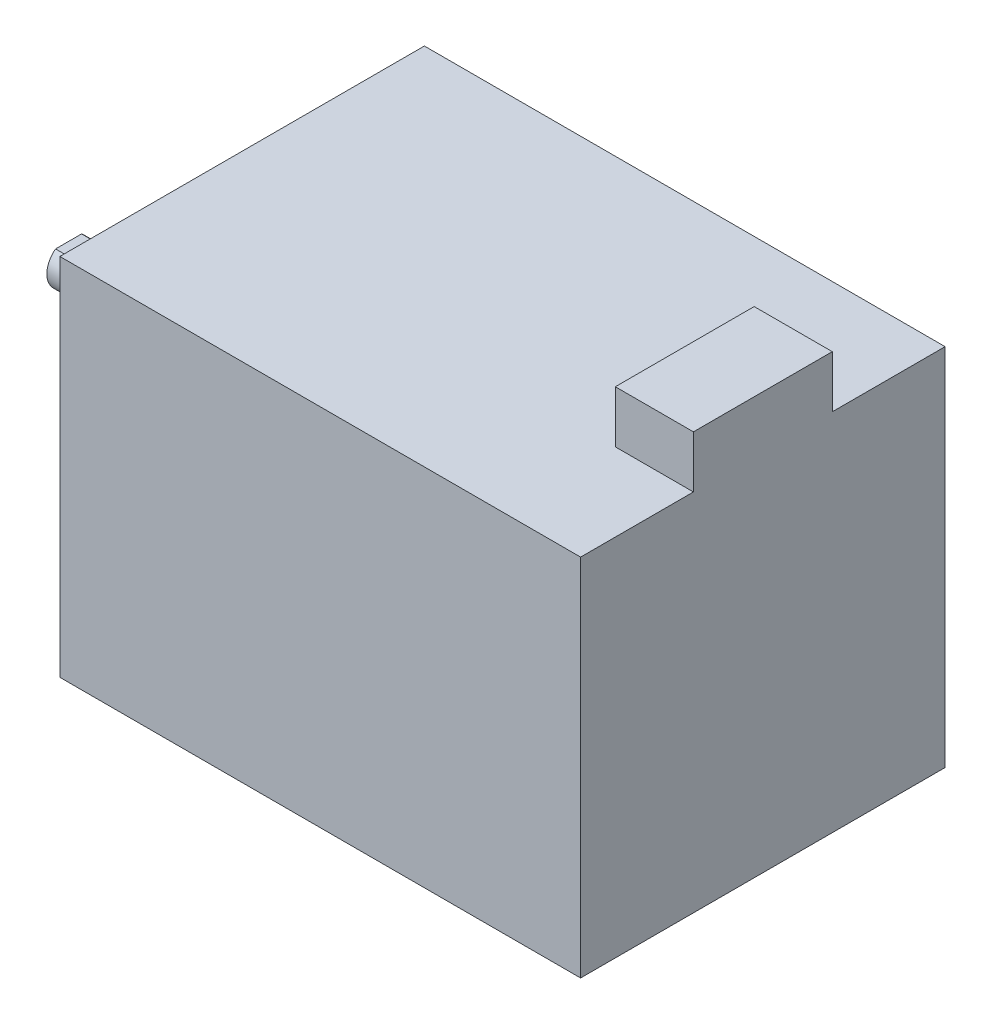
ISO-10303-21;
HEADER;
FILE_DESCRIPTION(('STEP AP214'),'2;1');
FILE_NAME('part.step','',(''),(''),'','','');
FILE_SCHEMA(('AUTOMOTIVE_DESIGN { 1 0 10303 214 1 1 1 1 }'));
ENDSEC;
DATA;
#1=APPLICATION_CONTEXT('core data for automotive mechanical design processes');
#2=APPLICATION_PROTOCOL_DEFINITION('international standard','automotive_design',2000,#1);
#3=PRODUCT_CONTEXT('',#1,'mechanical');
#4=PRODUCT('Part','Part','',(#3));
#5=PRODUCT_RELATED_PRODUCT_CATEGORY('part','',(#4));
#6=PRODUCT_DEFINITION_FORMATION('','',#4);
#7=PRODUCT_DEFINITION_CONTEXT('part definition',#1,'design');
#8=PRODUCT_DEFINITION('design','',#6,#7);
#9=PRODUCT_DEFINITION_SHAPE('','',#8);
#10=(LENGTH_UNIT() NAMED_UNIT(*) SI_UNIT(.MILLI.,.METRE.));
#11=(NAMED_UNIT(*) PLANE_ANGLE_UNIT() SI_UNIT($,.RADIAN.));
#12=(NAMED_UNIT(*) SI_UNIT($,.STERADIAN.) SOLID_ANGLE_UNIT());
#13=UNCERTAINTY_MEASURE_WITH_UNIT(LENGTH_MEASURE(1.E-05),#10,'distance_accuracy_value','');
#14=(GEOMETRIC_REPRESENTATION_CONTEXT(3) GLOBAL_UNCERTAINTY_ASSIGNED_CONTEXT((#13)) GLOBAL_UNIT_ASSIGNED_CONTEXT((#10,
#11,#12)) REPRESENTATION_CONTEXT('',''));
#15=CARTESIAN_POINT('',(0.,0.,0.));
#16=DIRECTION('',(0.,0.,1.));
#17=DIRECTION('',(1.,0.,0.));
#18=AXIS2_PLACEMENT_3D('',#15,#16,#17);
#19=CARTESIAN_POINT('',(0.,0.,0.));
#20=DIRECTION('',(1.,0.,0.));
#21=DIRECTION('',(0.,0.,-1.));
#22=AXIS2_PLACEMENT_3D('',#19,#20,#21);
#23=PLANE('',#22);
#24=CARTESIAN_POINT('',(0.,15.5,15.5));
#25=DIRECTION('',(1.,0.,0.));
#26=DIRECTION('',(0.,0.,-1.));
#27=AXIS2_PLACEMENT_3D('',#24,#25,#26);
#28=CIRCLE('',#27,1.50000000000002);
#29=CARTESIAN_POINT('',(0.,15.5,14.));
#30=VERTEX_POINT('',#29);
#31=EDGE_CURVE('E502',#30,#30,#28,.F.);
#32=ORIENTED_EDGE('',*,*,#31,.F.);
#33=EDGE_LOOP('',(#32));
#34=FACE_BOUND('',#33,.T.);
#35=CARTESIAN_POINT('',(0.,-15.5,15.5));
#36=DIRECTION('',(1.,0.,0.));
#37=DIRECTION('',(0.,0.,-1.));
#38=AXIS2_PLACEMENT_3D('',#35,#36,#37);
#39=CIRCLE('',#38,1.5);
#40=CARTESIAN_POINT('',(0.,-15.5,14.));
#41=VERTEX_POINT('',#40);
#42=EDGE_CURVE('E495',#41,#41,#39,.T.);
#43=ORIENTED_EDGE('',*,*,#42,.T.);
#44=EDGE_LOOP('',(#43));
#45=FACE_BOUND('',#44,.T.);
#46=DIRECTION('',(0.,0.,-1.));
#47=VECTOR('',#46,1.);
#48=CARTESIAN_POINT('',(0.,2.,0.));
#49=LINE('',#48,#47);
#50=CARTESIAN_POINT('',(0.,2.,1.5));
#51=VERTEX_POINT('',#50);
#52=CARTESIAN_POINT('',(0.,2.,-1.5));
#53=VERTEX_POINT('',#52);
#54=EDGE_CURVE('E63',#51,#53,#49,.T.);
#55=ORIENTED_EDGE('',*,*,#54,.F.);
#56=CARTESIAN_POINT('',(0.,0.,0.));
#57=DIRECTION('',(1.,0.,0.));
#58=DIRECTION('',(0.,0.,-1.));
#59=AXIS2_PLACEMENT_3D('',#56,#57,#58);
#60=CIRCLE('',#59,2.5);
#61=EDGE_CURVE('E144',#51,#53,#60,.T.);
#62=ORIENTED_EDGE('',*,*,#61,.T.);
#63=EDGE_LOOP('',(#55,#62));
#64=FACE_BOUND('',#63,.T.);
#65=DIRECTION('',(0.,0.,-1.));
#66=VECTOR('',#65,1.);
#67=CARTESIAN_POINT('',(0.,21.,0.));
#68=LINE('',#67,#66);
#69=CARTESIAN_POINT('',(0.,21.,21.));
#70=VERTEX_POINT('',#69);
#71=CARTESIAN_POINT('',(0.,21.,-21.));
#72=VERTEX_POINT('',#71);
#73=EDGE_CURVE('E192',#70,#72,#68,.T.);
#74=ORIENTED_EDGE('',*,*,#73,.T.);
#75=DIRECTION('',(0.,1.,0.));
#76=VECTOR('',#75,1.);
#77=CARTESIAN_POINT('',(0.,0.,-21.));
#78=LINE('',#77,#76);
#79=CARTESIAN_POINT('',(0.,-21.,-21.));
#80=VERTEX_POINT('',#79);
#81=EDGE_CURVE('E188',#80,#72,#78,.T.);
#82=ORIENTED_EDGE('',*,*,#81,.F.);
#83=DIRECTION('',(0.,0.,-1.));
#84=VECTOR('',#83,1.);
#85=CARTESIAN_POINT('',(0.,-21.,0.));
#86=LINE('',#85,#84);
#87=CARTESIAN_POINT('',(0.,-21.,21.));
#88=VERTEX_POINT('',#87);
#89=EDGE_CURVE('E164',#88,#80,#86,.T.);
#90=ORIENTED_EDGE('',*,*,#89,.F.);
#91=DIRECTION('',(0.,1.,0.));
#92=VECTOR('',#91,1.);
#93=CARTESIAN_POINT('',(0.,0.,21.));
#94=LINE('',#93,#92);
#95=EDGE_CURVE('E172',#88,#70,#94,.T.);
#96=ORIENTED_EDGE('',*,*,#95,.T.);
#97=EDGE_LOOP('',(#74,#82,#90,#96));
#98=FACE_BOUND('',#97,.T.);
#99=CARTESIAN_POINT('',(0.,15.5,-15.5));
#100=DIRECTION('',(1.,0.,0.));
#101=DIRECTION('',(0.,0.,-1.));
#102=AXIS2_PLACEMENT_3D('',#99,#100,#101);
#103=CIRCLE('',#102,1.5);
#104=CARTESIAN_POINT('',(0.,15.5,-17.));
#105=VERTEX_POINT('',#104);
#106=EDGE_CURVE('E480',#105,#105,#103,.T.);
#107=ORIENTED_EDGE('',*,*,#106,.T.);
#108=EDGE_LOOP('',(#107));
#109=FACE_BOUND('',#108,.T.);
#110=CARTESIAN_POINT('',(0.,-15.5,-15.5));
#111=DIRECTION('',(1.,0.,0.));
#112=DIRECTION('',(0.,0.,-1.));
#113=AXIS2_PLACEMENT_3D('',#110,#111,#112);
#114=CIRCLE('',#113,1.5);
#115=CARTESIAN_POINT('',(0.,-15.5,-17.));
#116=VERTEX_POINT('',#115);
#117=EDGE_CURVE('E481',#116,#116,#114,.F.);
#118=ORIENTED_EDGE('',*,*,#117,.F.);
#119=EDGE_LOOP('',(#118));
#120=FACE_BOUND('',#119,.T.);
#121=ADVANCED_FACE('F39',(#34,#45,#64,#98,#109,#120),#23,.F.);
#122=CARTESIAN_POINT('',(60.,-21.,0.));
#123=DIRECTION('',(0.,1.,0.));
#124=DIRECTION('',(0.,0.,1.));
#125=AXIS2_PLACEMENT_3D('',#122,#123,#124);
#126=PLANE('',#125);
#127=ORIENTED_EDGE('',*,*,#89,.T.);
#128=DIRECTION('',(-1.,0.,0.));
#129=VECTOR('',#128,1.);
#130=CARTESIAN_POINT('',(60.,-21.,-21.));
#131=LINE('',#130,#129);
#132=CARTESIAN_POINT('',(60.,-21.,-21.));
#133=VERTEX_POINT('',#132);
#134=EDGE_CURVE('E11',#133,#80,#131,.T.);
#135=ORIENTED_EDGE('',*,*,#134,.F.);
#136=DIRECTION('',(0.,0.,-1.));
#137=VECTOR('',#136,1.);
#138=CARTESIAN_POINT('',(60.,-21.,0.));
#139=LINE('',#138,#137);
#140=CARTESIAN_POINT('',(60.,-21.,21.));
#141=VERTEX_POINT('',#140);
#142=EDGE_CURVE('E167',#141,#133,#139,.T.);
#143=ORIENTED_EDGE('',*,*,#142,.F.);
#144=DIRECTION('',(-1.,0.,0.));
#145=VECTOR('',#144,1.);
#146=CARTESIAN_POINT('',(60.,-21.,21.));
#147=LINE('',#146,#145);
#148=EDGE_CURVE('E184',#141,#88,#147,.T.);
#149=ORIENTED_EDGE('',*,*,#148,.T.);
#150=EDGE_LOOP('',(#127,#135,#143,#149));
#151=FACE_BOUND('',#150,.T.);
#152=ADVANCED_FACE('F41',(#151),#126,.F.);
#153=CARTESIAN_POINT('',(60.,0.,-21.));
#154=DIRECTION('',(0.,0.,1.));
#155=DIRECTION('',(1.,0.,0.));
#156=AXIS2_PLACEMENT_3D('',#153,#154,#155);
#157=PLANE('',#156);
#158=ORIENTED_EDGE('',*,*,#81,.T.);
#159=DIRECTION('',(-1.,0.,0.));
#160=VECTOR('',#159,1.);
#161=CARTESIAN_POINT('',(60.,21.,-21.));
#162=LINE('',#161,#160);
#163=CARTESIAN_POINT('',(60.,21.,-21.));
#164=VERTEX_POINT('',#163);
#165=EDGE_CURVE('E48',#164,#72,#162,.T.);
#166=ORIENTED_EDGE('',*,*,#165,.F.);
#167=DIRECTION('',(0.,1.,0.));
#168=VECTOR('',#167,1.);
#169=CARTESIAN_POINT('',(60.,0.,-21.));
#170=LINE('',#169,#168);
#171=EDGE_CURVE('E171',#133,#164,#170,.T.);
#172=ORIENTED_EDGE('',*,*,#171,.F.);
#173=ORIENTED_EDGE('',*,*,#134,.T.);
#174=EDGE_LOOP('',(#158,#166,#172,#173));
#175=FACE_BOUND('',#174,.T.);
#176=ADVANCED_FACE('F207',(#175),#157,.F.);
#177=CARTESIAN_POINT('',(60.,21.,0.));
#178=DIRECTION('',(0.,1.,0.));
#179=DIRECTION('',(0.,0.,1.));
#180=AXIS2_PLACEMENT_3D('',#177,#178,#179);
#181=PLANE('',#180);
#182=DIRECTION('',(-1.,0.,0.));
#183=VECTOR('',#182,1.);
#184=CARTESIAN_POINT('',(60.,21.,-8.));
#185=LINE('',#184,#183);
#186=CARTESIAN_POINT('',(60.,21.,-8.));
#187=VERTEX_POINT('',#186);
#188=CARTESIAN_POINT('',(51.,21.,-8.));
#189=VERTEX_POINT('',#188);
#190=EDGE_CURVE('E130',#187,#189,#185,.T.);
#191=ORIENTED_EDGE('',*,*,#190,.F.);
#192=DIRECTION('',(0.,0.,-1.));
#193=VECTOR('',#192,1.);
#194=CARTESIAN_POINT('',(60.,21.,0.));
#195=LINE('',#194,#193);
#196=EDGE_CURVE('E176',#187,#164,#195,.T.);
#197=ORIENTED_EDGE('',*,*,#196,.T.);
#198=ORIENTED_EDGE('',*,*,#165,.T.);
#199=ORIENTED_EDGE('',*,*,#73,.F.);
#200=DIRECTION('',(-1.,0.,0.));
#201=VECTOR('',#200,1.);
#202=CARTESIAN_POINT('',(60.,21.,21.));
#203=LINE('',#202,#201);
#204=CARTESIAN_POINT('',(60.,21.,21.));
#205=VERTEX_POINT('',#204);
#206=EDGE_CURVE('E200',#205,#70,#203,.T.);
#207=ORIENTED_EDGE('',*,*,#206,.F.);
#208=CARTESIAN_POINT('',(60.,21.,8.));
#209=VERTEX_POINT('',#208);
#210=EDGE_CURVE('E177',#205,#209,#195,.T.);
#211=ORIENTED_EDGE('',*,*,#210,.T.);
#212=DIRECTION('',(-1.,0.,0.));
#213=VECTOR('',#212,1.);
#214=CARTESIAN_POINT('',(60.,21.,8.));
#215=LINE('',#214,#213);
#216=CARTESIAN_POINT('',(51.,21.,8.));
#217=VERTEX_POINT('',#216);
#218=EDGE_CURVE('E133',#209,#217,#215,.T.);
#219=ORIENTED_EDGE('',*,*,#218,.T.);
#220=DIRECTION('',(0.,0.,-1.));
#221=VECTOR('',#220,1.);
#222=CARTESIAN_POINT('',(51.,21.,0.));
#223=LINE('',#222,#221);
#224=EDGE_CURVE('E55',#217,#189,#223,.T.);
#225=ORIENTED_EDGE('',*,*,#224,.T.);
#226=EDGE_LOOP('',(#191,#197,#198,#199,#207,#211,#219,#225));
#227=FACE_BOUND('',#226,.T.);
#228=ADVANCED_FACE('F129',(#227),#181,.T.);
#229=CARTESIAN_POINT('',(60.,0.,21.));
#230=DIRECTION('',(0.,0.,1.));
#231=DIRECTION('',(1.,0.,0.));
#232=AXIS2_PLACEMENT_3D('',#229,#230,#231);
#233=PLANE('',#232);
#234=ORIENTED_EDGE('',*,*,#95,.F.);
#235=ORIENTED_EDGE('',*,*,#148,.F.);
#236=DIRECTION('',(0.,1.,0.));
#237=VECTOR('',#236,1.);
#238=CARTESIAN_POINT('',(60.,0.,21.));
#239=LINE('',#238,#237);
#240=EDGE_CURVE('E180',#141,#205,#239,.T.);
#241=ORIENTED_EDGE('',*,*,#240,.T.);
#242=ORIENTED_EDGE('',*,*,#206,.T.);
#243=EDGE_LOOP('',(#234,#235,#241,#242));
#244=FACE_BOUND('',#243,.T.);
#245=ADVANCED_FACE('F214',(#244),#233,.T.);
#246=CARTESIAN_POINT('',(60.,0.,0.));
#247=DIRECTION('',(1.,0.,0.));
#248=DIRECTION('',(0.,0.,-1.));
#249=AXIS2_PLACEMENT_3D('',#246,#247,#248);
#250=PLANE('',#249);
#251=ORIENTED_EDGE('',*,*,#142,.T.);
#252=ORIENTED_EDGE('',*,*,#171,.T.);
#253=ORIENTED_EDGE('',*,*,#196,.F.);
#254=DIRECTION('',(0.,1.,0.));
#255=VECTOR('',#254,1.);
#256=CARTESIAN_POINT('',(60.,0.,-8.));
#257=LINE('',#256,#255);
#258=CARTESIAN_POINT('',(60.,27.,-8.));
#259=VERTEX_POINT('',#258);
#260=EDGE_CURVE('E138',#187,#259,#257,.T.);
#261=ORIENTED_EDGE('',*,*,#260,.T.);
#262=DIRECTION('',(0.,0.,-1.));
#263=VECTOR('',#262,1.);
#264=CARTESIAN_POINT('',(60.,27.,0.));
#265=LINE('',#264,#263);
#266=CARTESIAN_POINT('',(60.,27.,8.));
#267=VERTEX_POINT('',#266);
#268=EDGE_CURVE('E225',#267,#259,#265,.T.);
#269=ORIENTED_EDGE('',*,*,#268,.F.);
#270=DIRECTION('',(0.,1.,0.));
#271=VECTOR('',#270,1.);
#272=CARTESIAN_POINT('',(60.,0.,8.));
#273=LINE('',#272,#271);
#274=EDGE_CURVE('E223',#209,#267,#273,.T.);
#275=ORIENTED_EDGE('',*,*,#274,.F.);
#276=ORIENTED_EDGE('',*,*,#210,.F.);
#277=ORIENTED_EDGE('',*,*,#240,.F.);
#278=EDGE_LOOP('',(#251,#252,#253,#261,#269,#275,#276,#277));
#279=FACE_BOUND('',#278,.T.);
#280=ADVANCED_FACE('F220',(#279),#250,.T.);
#281=CARTESIAN_POINT('',(-20.,2.,0.));
#282=DIRECTION('',(0.,-1.,0.));
#283=DIRECTION('',(0.,0.,-1.));
#284=AXIS2_PLACEMENT_3D('',#281,#282,#283);
#285=PLANE('',#284);
#286=ORIENTED_EDGE('',*,*,#54,.T.);
#287=DIRECTION('',(1.,0.,0.));
#288=VECTOR('',#287,1.);
#289=CARTESIAN_POINT('',(-20.,2.,-1.5));
#290=LINE('',#289,#288);
#291=CARTESIAN_POINT('',(-20.,2.,-1.5));
#292=VERTEX_POINT('',#291);
#293=EDGE_CURVE('E161',#292,#53,#290,.T.);
#294=ORIENTED_EDGE('',*,*,#293,.F.);
#295=DIRECTION('',(0.,0.,-1.));
#296=VECTOR('',#295,1.);
#297=CARTESIAN_POINT('',(-20.,2.,0.));
#298=LINE('',#297,#296);
#299=CARTESIAN_POINT('',(-20.,2.,1.5));
#300=VERTEX_POINT('',#299);
#301=EDGE_CURVE('E150',#300,#292,#298,.T.);
#302=ORIENTED_EDGE('',*,*,#301,.F.);
#303=DIRECTION('',(1.,0.,0.));
#304=VECTOR('',#303,1.);
#305=CARTESIAN_POINT('',(-20.,2.,1.5));
#306=LINE('',#305,#304);
#307=EDGE_CURVE('E156',#300,#51,#306,.T.);
#308=ORIENTED_EDGE('',*,*,#307,.T.);
#309=EDGE_LOOP('',(#286,#294,#302,#308));
#310=FACE_BOUND('',#309,.T.);
#311=ADVANCED_FACE('F281',(#310),#285,.F.);
#312=CARTESIAN_POINT('',(-20.,0.,0.));
#313=DIRECTION('',(1.,0.,0.));
#314=DIRECTION('',(0.,0.,-1.));
#315=AXIS2_PLACEMENT_3D('',#312,#313,#314);
#316=CYLINDRICAL_SURFACE('',#315,2.5);
#317=ORIENTED_EDGE('',*,*,#61,.F.);
#318=ORIENTED_EDGE('',*,*,#307,.F.);
#319=CARTESIAN_POINT('',(-20.,0.,0.));
#320=DIRECTION('',(1.,0.,0.));
#321=DIRECTION('',(0.,0.,-1.));
#322=AXIS2_PLACEMENT_3D('',#319,#320,#321);
#323=CIRCLE('',#322,2.5);
#324=EDGE_CURVE('E153',#300,#292,#323,.T.);
#325=ORIENTED_EDGE('',*,*,#324,.T.);
#326=ORIENTED_EDGE('',*,*,#293,.T.);
#327=EDGE_LOOP('',(#317,#318,#325,#326));
#328=FACE_BOUND('',#327,.T.);
#329=ADVANCED_FACE('F287',(#328),#316,.T.);
#330=CARTESIAN_POINT('',(-20.,0.,0.));
#331=DIRECTION('',(1.,0.,0.));
#332=DIRECTION('',(0.,0.,-1.));
#333=AXIS2_PLACEMENT_3D('',#330,#331,#332);
#334=PLANE('',#333);
#335=ORIENTED_EDGE('',*,*,#301,.T.);
#336=ORIENTED_EDGE('',*,*,#324,.F.);
#337=EDGE_LOOP('',(#335,#336));
#338=FACE_BOUND('',#337,.T.);
#339=ADVANCED_FACE('F293',(#338),#334,.F.);
#340=CARTESIAN_POINT('',(60.,0.,-8.));
#341=DIRECTION('',(0.,0.,1.));
#342=DIRECTION('',(1.,0.,0.));
#343=AXIS2_PLACEMENT_3D('',#340,#341,#342);
#344=PLANE('',#343);
#345=ORIENTED_EDGE('',*,*,#190,.T.);
#346=DIRECTION('',(0.,1.,0.));
#347=VECTOR('',#346,1.);
#348=CARTESIAN_POINT('',(51.,0.,-8.));
#349=LINE('',#348,#347);
#350=CARTESIAN_POINT('',(51.,27.,-8.));
#351=VERTEX_POINT('',#350);
#352=EDGE_CURVE('E116',#189,#351,#349,.T.);
#353=ORIENTED_EDGE('',*,*,#352,.T.);
#354=DIRECTION('',(-1.,0.,0.));
#355=VECTOR('',#354,1.);
#356=CARTESIAN_POINT('',(60.,27.,-8.));
#357=LINE('',#356,#355);
#358=EDGE_CURVE('E140',#259,#351,#357,.T.);
#359=ORIENTED_EDGE('',*,*,#358,.F.);
#360=ORIENTED_EDGE('',*,*,#260,.F.);
#361=EDGE_LOOP('',(#345,#353,#359,#360));
#362=FACE_BOUND('',#361,.T.);
#363=ADVANCED_FACE('F137',(#362),#344,.F.);
#364=CARTESIAN_POINT('',(60.,27.,0.));
#365=DIRECTION('',(0.,1.,0.));
#366=DIRECTION('',(0.,0.,1.));
#367=AXIS2_PLACEMENT_3D('',#364,#365,#366);
#368=PLANE('',#367);
#369=DIRECTION('',(0.,0.,-1.));
#370=VECTOR('',#369,1.);
#371=CARTESIAN_POINT('',(51.,27.,0.));
#372=LINE('',#371,#370);
#373=CARTESIAN_POINT('',(51.,27.,8.));
#374=VERTEX_POINT('',#373);
#375=EDGE_CURVE('E119',#374,#351,#372,.T.);
#376=ORIENTED_EDGE('',*,*,#375,.F.);
#377=DIRECTION('',(-1.,0.,0.));
#378=VECTOR('',#377,1.);
#379=CARTESIAN_POINT('',(60.,27.,8.));
#380=LINE('',#379,#378);
#381=EDGE_CURVE('E146',#267,#374,#380,.T.);
#382=ORIENTED_EDGE('',*,*,#381,.F.);
#383=ORIENTED_EDGE('',*,*,#268,.T.);
#384=ORIENTED_EDGE('',*,*,#358,.T.);
#385=EDGE_LOOP('',(#376,#382,#383,#384));
#386=FACE_BOUND('',#385,.T.);
#387=ADVANCED_FACE('F239',(#386),#368,.T.);
#388=CARTESIAN_POINT('',(60.,0.,8.));
#389=DIRECTION('',(0.,0.,1.));
#390=DIRECTION('',(1.,0.,0.));
#391=AXIS2_PLACEMENT_3D('',#388,#389,#390);
#392=PLANE('',#391);
#393=DIRECTION('',(0.,1.,0.));
#394=VECTOR('',#393,1.);
#395=CARTESIAN_POINT('',(51.,0.,8.));
#396=LINE('',#395,#394);
#397=EDGE_CURVE('E237',#217,#374,#396,.T.);
#398=ORIENTED_EDGE('',*,*,#397,.F.);
#399=ORIENTED_EDGE('',*,*,#218,.F.);
#400=ORIENTED_EDGE('',*,*,#274,.T.);
#401=ORIENTED_EDGE('',*,*,#381,.T.);
#402=EDGE_LOOP('',(#398,#399,#400,#401));
#403=FACE_BOUND('',#402,.T.);
#404=ADVANCED_FACE('F236',(#403),#392,.T.);
#405=CARTESIAN_POINT('',(51.,0.,0.));
#406=DIRECTION('',(1.,0.,0.));
#407=DIRECTION('',(0.,0.,-1.));
#408=AXIS2_PLACEMENT_3D('',#405,#406,#407);
#409=PLANE('',#408);
#410=ORIENTED_EDGE('',*,*,#224,.F.);
#411=ORIENTED_EDGE('',*,*,#397,.T.);
#412=ORIENTED_EDGE('',*,*,#375,.T.);
#413=ORIENTED_EDGE('',*,*,#352,.F.);
#414=EDGE_LOOP('',(#410,#411,#412,#413));
#415=FACE_BOUND('',#414,.T.);
#416=ADVANCED_FACE('F117',(#415),#409,.F.);
#417=CARTESIAN_POINT('',(10.,-15.5,15.5));
#418=DIRECTION('',(-1.,0.,0.));
#419=DIRECTION('',(0.,0.,1.));
#420=AXIS2_PLACEMENT_3D('',#417,#418,#419);
#421=CYLINDRICAL_SURFACE('',#420,1.5);
#422=CARTESIAN_POINT('',(10.,-15.5,15.5));
#423=DIRECTION('',(1.,0.,0.));
#424=DIRECTION('',(0.,0.,-1.));
#425=AXIS2_PLACEMENT_3D('',#422,#423,#424);
#426=CIRCLE('',#425,1.5);
#427=CARTESIAN_POINT('',(10.,-15.5,14.));
#428=VERTEX_POINT('',#427);
#429=EDGE_CURVE('E135',#428,#428,#426,.T.);
#430=ORIENTED_EDGE('',*,*,#429,.T.);
#431=EDGE_LOOP('',(#430));
#432=FACE_BOUND('',#431,.T.);
#433=ORIENTED_EDGE('',*,*,#42,.F.);
#434=EDGE_LOOP('',(#433));
#435=FACE_BOUND('',#434,.T.);
#436=ADVANCED_FACE('F323',(#432,#435),#421,.F.);
#437=CARTESIAN_POINT('',(10.,0.,0.));
#438=DIRECTION('',(1.,0.,0.));
#439=DIRECTION('',(0.,0.,-1.));
#440=AXIS2_PLACEMENT_3D('',#437,#438,#439);
#441=PLANE('',#440);
#442=ORIENTED_EDGE('',*,*,#429,.F.);
#443=EDGE_LOOP('',(#442));
#444=FACE_BOUND('',#443,.T.);
#445=ADVANCED_FACE('F330',(#444),#441,.F.);
#446=CARTESIAN_POINT('',(10.,15.5,15.5));
#447=DIRECTION('',(-1.,0.,0.));
#448=DIRECTION('',(0.,0.,1.));
#449=AXIS2_PLACEMENT_3D('',#446,#447,#448);
#450=CYLINDRICAL_SURFACE('',#449,1.50000000000002);
#451=CARTESIAN_POINT('',(10.,15.5,15.5));
#452=DIRECTION('',(1.,0.,0.));
#453=DIRECTION('',(0.,0.,-1.));
#454=AXIS2_PLACEMENT_3D('',#451,#452,#453);
#455=CIRCLE('',#454,1.50000000000002);
#456=CARTESIAN_POINT('',(10.,15.5,14.));
#457=VERTEX_POINT('',#456);
#458=EDGE_CURVE('E498',#457,#457,#455,.F.);
#459=ORIENTED_EDGE('',*,*,#458,.F.);
#460=EDGE_LOOP('',(#459));
#461=FACE_BOUND('',#460,.T.);
#462=ORIENTED_EDGE('',*,*,#31,.T.);
#463=EDGE_LOOP('',(#462));
#464=FACE_BOUND('',#463,.T.);
#465=ADVANCED_FACE('F338',(#461,#464),#450,.F.);
#466=CARTESIAN_POINT('',(10.,0.,0.));
#467=DIRECTION('',(1.,0.,0.));
#468=DIRECTION('',(0.,0.,-1.));
#469=AXIS2_PLACEMENT_3D('',#466,#467,#468);
#470=PLANE('',#469);
#471=ORIENTED_EDGE('',*,*,#458,.T.);
#472=EDGE_LOOP('',(#471));
#473=FACE_BOUND('',#472,.T.);
#474=ADVANCED_FACE('F346',(#473),#470,.F.);
#475=CARTESIAN_POINT('',(10.,15.5,-15.5));
#476=DIRECTION('',(-1.,0.,0.));
#477=DIRECTION('',(0.,0.,1.));
#478=AXIS2_PLACEMENT_3D('',#475,#476,#477);
#479=CYLINDRICAL_SURFACE('',#478,1.5);
#480=CARTESIAN_POINT('',(10.,15.5,-15.5));
#481=DIRECTION('',(1.,0.,0.));
#482=DIRECTION('',(0.,0.,-1.));
#483=AXIS2_PLACEMENT_3D('',#480,#481,#482);
#484=CIRCLE('',#483,1.5);
#485=CARTESIAN_POINT('',(10.,15.5,-17.));
#486=VERTEX_POINT('',#485);
#487=EDGE_CURVE('E486',#486,#486,#484,.T.);
#488=ORIENTED_EDGE('',*,*,#487,.T.);
#489=EDGE_LOOP('',(#488));
#490=FACE_BOUND('',#489,.T.);
#491=ORIENTED_EDGE('',*,*,#106,.F.);
#492=EDGE_LOOP('',(#491));
#493=FACE_BOUND('',#492,.T.);
#494=ADVANCED_FACE('F354',(#490,#493),#479,.F.);
#495=CARTESIAN_POINT('',(10.,0.,0.));
#496=DIRECTION('',(1.,0.,0.));
#497=DIRECTION('',(0.,0.,-1.));
#498=AXIS2_PLACEMENT_3D('',#495,#496,#497);
#499=PLANE('',#498);
#500=ORIENTED_EDGE('',*,*,#487,.F.);
#501=EDGE_LOOP('',(#500));
#502=FACE_BOUND('',#501,.T.);
#503=ADVANCED_FACE('F362',(#502),#499,.F.);
#504=CARTESIAN_POINT('',(10.,-15.5,-15.5));
#505=DIRECTION('',(-1.,0.,0.));
#506=DIRECTION('',(0.,0.,1.));
#507=AXIS2_PLACEMENT_3D('',#504,#505,#506);
#508=CYLINDRICAL_SURFACE('',#507,1.5);
#509=CARTESIAN_POINT('',(10.,-15.5,-15.5));
#510=DIRECTION('',(1.,0.,0.));
#511=DIRECTION('',(0.,0.,-1.));
#512=AXIS2_PLACEMENT_3D('',#509,#510,#511);
#513=CIRCLE('',#512,1.5);
#514=CARTESIAN_POINT('',(10.,-15.5,-17.));
#515=VERTEX_POINT('',#514);
#516=EDGE_CURVE('E478',#515,#515,#513,.F.);
#517=ORIENTED_EDGE('',*,*,#516,.F.);
#518=EDGE_LOOP('',(#517));
#519=FACE_BOUND('',#518,.T.);
#520=ORIENTED_EDGE('',*,*,#117,.T.);
#521=EDGE_LOOP('',(#520));
#522=FACE_BOUND('',#521,.T.);
#523=ADVANCED_FACE('F370',(#519,#522),#508,.F.);
#524=CARTESIAN_POINT('',(10.,0.,0.));
#525=DIRECTION('',(1.,0.,0.));
#526=DIRECTION('',(0.,0.,-1.));
#527=AXIS2_PLACEMENT_3D('',#524,#525,#526);
#528=PLANE('',#527);
#529=ORIENTED_EDGE('',*,*,#516,.T.);
#530=EDGE_LOOP('',(#529));
#531=FACE_BOUND('',#530,.T.);
#532=ADVANCED_FACE('F378',(#531),#528,.F.);
#533=CLOSED_SHELL('',(#121,#152,#176,#228,#245,#280,#311,#329,#339,#363,#387,#404,#416,#436,
#445,#465,#474,#494,#503,#523,#532));
#534=MANIFOLD_SOLID_BREP('B2',#533);
#535=ADVANCED_BREP_SHAPE_REPRESENTATION('',(#18,#534),#14);
#536=SHAPE_DEFINITION_REPRESENTATION(#9,#535);
ENDSEC;
END-ISO-10303-21;
